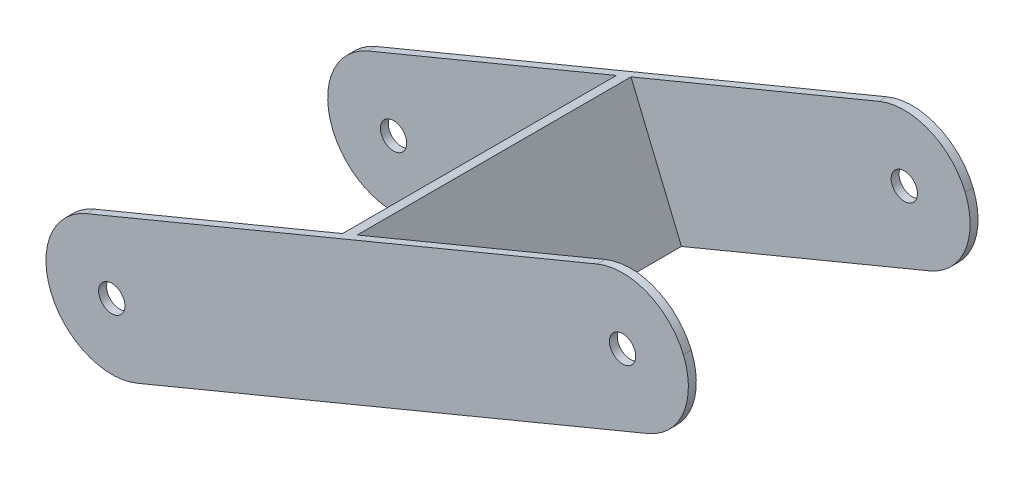
ISO-10303-21;
HEADER;
FILE_DESCRIPTION(('STEP AP214'),'2;1');
FILE_NAME('part.step','',(''),(''),'','','');
FILE_SCHEMA(('AUTOMOTIVE_DESIGN { 1 0 10303 214 1 1 1 1 }'));
ENDSEC;
DATA;
#1=APPLICATION_CONTEXT('core data for automotive mechanical design processes');
#2=APPLICATION_PROTOCOL_DEFINITION('international standard','automotive_design',2000,#1);
#3=PRODUCT_CONTEXT('',#1,'mechanical');
#4=PRODUCT('Part','Part','',(#3));
#5=PRODUCT_RELATED_PRODUCT_CATEGORY('part','',(#4));
#6=PRODUCT_DEFINITION_FORMATION('','',#4);
#7=PRODUCT_DEFINITION_CONTEXT('part definition',#1,'design');
#8=PRODUCT_DEFINITION('design','',#6,#7);
#9=PRODUCT_DEFINITION_SHAPE('','',#8);
#10=(LENGTH_UNIT() NAMED_UNIT(*) SI_UNIT(.MILLI.,.METRE.));
#11=(NAMED_UNIT(*) PLANE_ANGLE_UNIT() SI_UNIT($,.RADIAN.));
#12=(NAMED_UNIT(*) SI_UNIT($,.STERADIAN.) SOLID_ANGLE_UNIT());
#13=UNCERTAINTY_MEASURE_WITH_UNIT(LENGTH_MEASURE(1.E-05),#10,'distance_accuracy_value','');
#14=(GEOMETRIC_REPRESENTATION_CONTEXT(3) GLOBAL_UNCERTAINTY_ASSIGNED_CONTEXT((#13)) GLOBAL_UNIT_ASSIGNED_CONTEXT((#10,
#11,#12)) REPRESENTATION_CONTEXT('',''));
#15=CARTESIAN_POINT('',(0.,0.,0.));
#16=DIRECTION('',(0.,0.,1.));
#17=DIRECTION('',(1.,0.,0.));
#18=AXIS2_PLACEMENT_3D('',#15,#16,#17);
#19=CARTESIAN_POINT('',(167.042618659577,74.571027458116,-1.4821249531837));
#20=DIRECTION('',(0.,0.,1.));
#21=DIRECTION('',(0.923728021347068,0.383049008063238,0.));
#22=AXIS2_PLACEMENT_3D('',#19,#20,#21);
#23=PLANE('',#22);
#24=CARTESIAN_POINT('',(123.335010139646,42.9143542679577,-1.4821249531837));
#25=DIRECTION('',(0.,0.,-1.));
#26=DIRECTION('',(-0.923728021347068,-0.383049008063238,0.));
#27=AXIS2_PLACEMENT_3D('',#24,#25,#26);
#28=CIRCLE('',#27,2.5);
#29=CARTESIAN_POINT('',(121.025690086278,41.9567317477996,-1.4821249531837));
#30=VERTEX_POINT('',#29);
#31=EDGE_CURVE('E272',#30,#30,#28,.T.);
#32=ORIENTED_EDGE('',*,*,#31,.F.);
#33=EDGE_LOOP('',(#32));
#34=FACE_BOUND('',#33,.T.);
#35=CARTESIAN_POINT('',(220.326452381088,83.1345001145976,-1.4821249531837));
#36=DIRECTION('',(0.,0.,1.));
#37=DIRECTION('',(0.923728021347068,0.383049008063238,0.));
#38=AXIS2_PLACEMENT_3D('',#35,#36,#37);
#39=CIRCLE('',#38,2.5);
#40=CARTESIAN_POINT('',(222.635772434456,84.0921226347557,-1.4821249531837));
#41=VERTEX_POINT('',#40);
#42=EDGE_CURVE('E170',#41,#41,#39,.T.);
#43=ORIENTED_EDGE('',*,*,#42,.T.);
#44=EDGE_LOOP('',(#43));
#45=FACE_BOUND('',#44,.T.);
#46=DIRECTION('',(-0.923728021347068,-0.383049008063238,0.));
#47=VECTOR('',#46,1.);
#48=CARTESIAN_POINT('',(176.618843861158,51.4778269244393,-1.4821249531837));
#49=LINE('',#48,#47);
#50=CARTESIAN_POINT('',(225.114564981879,71.5878998477593,-1.4821249531837));
#51=VERTEX_POINT('',#50);
#52=CARTESIAN_POINT('',(128.123122740436,31.3677540011193,-1.4821249531837));
#53=VERTEX_POINT('',#52);
#54=EDGE_CURVE('E191',#51,#53,#49,.T.);
#55=ORIENTED_EDGE('',*,*,#54,.T.);
#56=CARTESIAN_POINT('',(123.335010139646,42.9143542679577,-1.4821249531837));
#57=DIRECTION('',(0.,0.,1.));
#58=DIRECTION('',(0.923728021347068,0.383049008063238,0.));
#59=AXIS2_PLACEMENT_3D('',#56,#57,#58);
#60=CIRCLE('',#59,12.5);
#61=CARTESIAN_POINT('',(111.788409872808,38.1262416671672,-1.4821249531837));
#62=VERTEX_POINT('',#61);
#63=EDGE_CURVE('E249',#53,#62,#60,.F.);
#64=ORIENTED_EDGE('',*,*,#63,.T.);
#65=CARTESIAN_POINT('',(123.335010139646,42.9143542679577,-1.4821249531837));
#66=DIRECTION('',(0.,0.,1.));
#67=DIRECTION('',(0.923728021347068,0.383049008063238,0.));
#68=AXIS2_PLACEMENT_3D('',#65,#66,#67);
#69=CIRCLE('',#68,12.5);
#70=CARTESIAN_POINT('',(118.546897538856,54.460954534796,-1.4821249531837));
#71=VERTEX_POINT('',#70);
#72=EDGE_CURVE('E247',#62,#71,#69,.F.);
#73=ORIENTED_EDGE('',*,*,#72,.T.);
#74=DIRECTION('',(-0.923728021347068,-0.383049008063238,0.));
#75=VECTOR('',#74,1.);
#76=CARTESIAN_POINT('',(167.042618659577,74.571027458116,-1.4821249531837));
#77=LINE('',#76,#75);
#78=CARTESIAN_POINT('',(215.538339780298,94.681100381436,-1.4821249531837));
#79=VERTEX_POINT('',#78);
#80=EDGE_CURVE('E178',#79,#71,#77,.T.);
#81=ORIENTED_EDGE('',*,*,#80,.F.);
#82=CARTESIAN_POINT('',(220.326452381088,83.1345001145976,-1.4821249531837));
#83=DIRECTION('',(0.,0.,1.));
#84=DIRECTION('',(0.923728021347068,0.383049008063238,0.));
#85=AXIS2_PLACEMENT_3D('',#82,#83,#84);
#86=CIRCLE('',#85,12.5);
#87=CARTESIAN_POINT('',(231.873052647927,87.9226127153881,-1.4821249531837));
#88=VERTEX_POINT('',#87);
#89=EDGE_CURVE('E208',#79,#88,#86,.F.);
#90=ORIENTED_EDGE('',*,*,#89,.T.);
#91=CARTESIAN_POINT('',(220.326452381088,83.1345001145976,-1.4821249531837));
#92=DIRECTION('',(0.,0.,1.));
#93=DIRECTION('',(0.923728021347068,0.383049008063238,0.));
#94=AXIS2_PLACEMENT_3D('',#91,#92,#93);
#95=CIRCLE('',#94,12.5);
#96=EDGE_CURVE('E210',#88,#51,#95,.F.);
#97=ORIENTED_EDGE('',*,*,#96,.T.);
#98=EDGE_LOOP('',(#55,#64,#73,#81,#90,#97));
#99=FACE_BOUND('',#98,.T.);
#100=ADVANCED_FACE('F16',(#34,#45,#99),#23,.F.);
#101=CARTESIAN_POINT('',(167.042618659577,74.571027458116,53.5178750468163));
#102=DIRECTION('',(0.,0.,-1.));
#103=DIRECTION('',(-0.923728021347068,-0.383049008063238,0.));
#104=AXIS2_PLACEMENT_3D('',#101,#102,#103);
#105=PLANE('',#104);
#106=CARTESIAN_POINT('',(123.335010139646,42.9143542679577,53.5178750468163));
#107=DIRECTION('',(0.,0.,-1.));
#108=DIRECTION('',(-0.923728021347068,-0.383049008063238,0.));
#109=AXIS2_PLACEMENT_3D('',#106,#107,#108);
#110=CIRCLE('',#109,2.5);
#111=CARTESIAN_POINT('',(121.025690086278,41.9567317477996,53.5178750468163));
#112=VERTEX_POINT('',#111);
#113=EDGE_CURVE('E276',#112,#112,#110,.T.);
#114=ORIENTED_EDGE('',*,*,#113,.T.);
#115=EDGE_LOOP('',(#114));
#116=FACE_BOUND('',#115,.T.);
#117=CARTESIAN_POINT('',(220.326452381088,83.1345001145976,53.5178750468163));
#118=DIRECTION('',(0.,0.,1.));
#119=DIRECTION('',(0.923728021347068,0.383049008063238,0.));
#120=AXIS2_PLACEMENT_3D('',#117,#118,#119);
#121=CIRCLE('',#120,2.5);
#122=CARTESIAN_POINT('',(222.635772434456,84.0921226347557,53.5178750468163));
#123=VERTEX_POINT('',#122);
#124=EDGE_CURVE('E141',#123,#123,#121,.T.);
#125=ORIENTED_EDGE('',*,*,#124,.F.);
#126=EDGE_LOOP('',(#125));
#127=FACE_BOUND('',#126,.T.);
#128=CARTESIAN_POINT('',(123.335010139646,42.9143542679577,53.5178750468163));
#129=DIRECTION('',(0.,0.,-1.));
#130=DIRECTION('',(-0.923728021347068,-0.383049008063238,0.));
#131=AXIS2_PLACEMENT_3D('',#128,#129,#130);
#132=CIRCLE('',#131,12.5);
#133=CARTESIAN_POINT('',(118.546897538856,54.460954534796,53.5178750468163));
#134=VERTEX_POINT('',#133);
#135=CARTESIAN_POINT('',(111.788409872808,38.1262416671672,53.5178750468163));
#136=VERTEX_POINT('',#135);
#137=EDGE_CURVE('E25',#134,#136,#132,.F.);
#138=ORIENTED_EDGE('',*,*,#137,.T.);
#139=CARTESIAN_POINT('',(123.335010139646,42.9143542679577,53.5178750468163));
#140=DIRECTION('',(0.,0.,-1.));
#141=DIRECTION('',(-0.923728021347068,-0.383049008063238,0.));
#142=AXIS2_PLACEMENT_3D('',#139,#140,#141);
#143=CIRCLE('',#142,12.5);
#144=CARTESIAN_POINT('',(128.123122740436,31.3677540011193,53.5178750468163));
#145=VERTEX_POINT('',#144);
#146=EDGE_CURVE('E10',#136,#145,#143,.F.);
#147=ORIENTED_EDGE('',*,*,#146,.T.);
#148=DIRECTION('',(0.923728021347068,0.383049008063238,0.));
#149=VECTOR('',#148,1.);
#150=CARTESIAN_POINT('',(176.618843861158,51.4778269244393,53.5178750468163));
#151=LINE('',#150,#149);
#152=CARTESIAN_POINT('',(225.114564981879,71.5878998477593,53.5178750468163));
#153=VERTEX_POINT('',#152);
#154=EDGE_CURVE('E194',#145,#153,#151,.T.);
#155=ORIENTED_EDGE('',*,*,#154,.T.);
#156=CARTESIAN_POINT('',(220.326452381088,83.1345001145976,53.5178750468163));
#157=DIRECTION('',(0.,0.,-1.));
#158=DIRECTION('',(-0.923728021347068,-0.383049008063238,0.));
#159=AXIS2_PLACEMENT_3D('',#156,#157,#158);
#160=CIRCLE('',#159,12.5);
#161=CARTESIAN_POINT('',(231.873052647927,87.9226127153881,53.5178750468163));
#162=VERTEX_POINT('',#161);
#163=EDGE_CURVE('E233',#153,#162,#160,.F.);
#164=ORIENTED_EDGE('',*,*,#163,.T.);
#165=CARTESIAN_POINT('',(220.326452381088,83.1345001145976,53.5178750468163));
#166=DIRECTION('',(0.,0.,-1.));
#167=DIRECTION('',(-0.923728021347068,-0.383049008063238,0.));
#168=AXIS2_PLACEMENT_3D('',#165,#166,#167);
#169=CIRCLE('',#168,12.5);
#170=CARTESIAN_POINT('',(215.538339780298,94.681100381436,53.5178750468163));
#171=VERTEX_POINT('',#170);
#172=EDGE_CURVE('E230',#162,#171,#169,.F.);
#173=ORIENTED_EDGE('',*,*,#172,.T.);
#174=DIRECTION('',(0.923728021347068,0.383049008063238,0.));
#175=VECTOR('',#174,1.);
#176=CARTESIAN_POINT('',(167.042618659577,74.571027458116,53.5178750468163));
#177=LINE('',#176,#175);
#178=EDGE_CURVE('E180',#134,#171,#177,.T.);
#179=ORIENTED_EDGE('',*,*,#178,.F.);
#180=EDGE_LOOP('',(#138,#147,#155,#164,#173,#179));
#181=FACE_BOUND('',#180,.T.);
#182=ADVANCED_FACE('F280',(#116,#127,#181),#105,.F.);
#183=CARTESIAN_POINT('',(168.428210691597,75.1456009702109,52.0178750468163));
#184=DIRECTION('',(0.,0.,1.));
#185=DIRECTION('',(0.923728021347068,0.383049008063238,0.));
#186=AXIS2_PLACEMENT_3D('',#183,#184,#185);
#187=PLANE('',#186);
#188=CARTESIAN_POINT('',(220.326452381088,83.1345001145976,52.0178750468163));
#189=DIRECTION('',(0.,0.,1.));
#190=DIRECTION('',(0.923728021347068,0.383049008063238,0.));
#191=AXIS2_PLACEMENT_3D('',#188,#189,#190);
#192=CIRCLE('',#191,2.5);
#193=CARTESIAN_POINT('',(222.635772434456,84.0921226347557,52.0178750468163));
#194=VERTEX_POINT('',#193);
#195=EDGE_CURVE('E174',#194,#194,#192,.T.);
#196=ORIENTED_EDGE('',*,*,#195,.T.);
#197=EDGE_LOOP('',(#196));
#198=FACE_BOUND('',#197,.T.);
#199=CARTESIAN_POINT('',(220.326452381088,83.1345001145976,52.0178750468163));
#200=DIRECTION('',(0.,0.,1.));
#201=DIRECTION('',(0.923728021347068,0.383049008063238,0.));
#202=AXIS2_PLACEMENT_3D('',#199,#200,#201);
#203=CIRCLE('',#202,12.5);
#204=CARTESIAN_POINT('',(215.538339780298,94.681100381436,52.0178750468163));
#205=VERTEX_POINT('',#204);
#206=CARTESIAN_POINT('',(231.873052647927,87.9226127153881,52.0178750468163));
#207=VERTEX_POINT('',#206);
#208=EDGE_CURVE('E226',#205,#207,#203,.F.);
#209=ORIENTED_EDGE('',*,*,#208,.T.);
#210=CARTESIAN_POINT('',(220.326452381088,83.1345001145976,52.0178750468163));
#211=DIRECTION('',(0.,0.,1.));
#212=DIRECTION('',(0.923728021347068,0.383049008063238,0.));
#213=AXIS2_PLACEMENT_3D('',#210,#211,#212);
#214=CIRCLE('',#213,12.5);
#215=CARTESIAN_POINT('',(225.114564981879,71.5878998477593,52.0178750468163));
#216=VERTEX_POINT('',#215);
#217=EDGE_CURVE('E228',#207,#216,#214,.F.);
#218=ORIENTED_EDGE('',*,*,#217,.T.);
#219=DIRECTION('',(-0.923728021347068,-0.383049008063238,0.));
#220=VECTOR('',#219,1.);
#221=CARTESIAN_POINT('',(178.004435893178,52.0524004365342,52.0178750468163));
#222=LINE('',#221,#220);
#223=CARTESIAN_POINT('',(178.004435893178,52.0524004365342,52.0178750468163));
#224=VERTEX_POINT('',#223);
#225=EDGE_CURVE('E197',#216,#224,#222,.T.);
#226=ORIENTED_EDGE('',*,*,#225,.T.);
#227=DIRECTION('',(0.383049008063238,-0.923728021347068,0.));
#228=VECTOR('',#227,1.);
#229=CARTESIAN_POINT('',(168.428210691597,75.1456009702109,52.0178750468163));
#230=LINE('',#229,#228);
#231=CARTESIAN_POINT('',(168.428210691597,75.1456009702109,52.0178750468163));
#232=VERTEX_POINT('',#231);
#233=EDGE_CURVE('E205',#232,#224,#230,.T.);
#234=ORIENTED_EDGE('',*,*,#233,.F.);
#235=DIRECTION('',(-0.923728021347068,-0.383049008063238,0.));
#236=VECTOR('',#235,1.);
#237=CARTESIAN_POINT('',(168.428210691597,75.1456009702109,52.0178750468163));
#238=LINE('',#237,#236);
#239=EDGE_CURVE('E183',#205,#232,#238,.T.);
#240=ORIENTED_EDGE('',*,*,#239,.F.);
#241=EDGE_LOOP('',(#209,#218,#226,#234,#240));
#242=FACE_BOUND('',#241,.T.);
#243=ADVANCED_FACE('F303',(#198,#242),#187,.F.);
#244=CARTESIAN_POINT('',(168.428210691597,75.1456009702109,52.0178750468163));
#245=DIRECTION('',(-0.923728021347068,-0.383049008063238,0.));
#246=DIRECTION('',(0.,0.,1.));
#247=AXIS2_PLACEMENT_3D('',#244,#245,#246);
#248=PLANE('',#247);
#249=DIRECTION('',(0.,0.,-1.));
#250=VECTOR('',#249,1.);
#251=CARTESIAN_POINT('',(178.004435893178,52.0524004365342,52.0178750468163));
#252=LINE('',#251,#250);
#253=CARTESIAN_POINT('',(178.004435893178,52.0524004365342,0.0178750468163014));
#254=VERTEX_POINT('',#253);
#255=EDGE_CURVE('E199',#224,#254,#252,.T.);
#256=ORIENTED_EDGE('',*,*,#255,.T.);
#257=DIRECTION('',(0.383049008063238,-0.923728021347068,0.));
#258=VECTOR('',#257,1.);
#259=CARTESIAN_POINT('',(168.428210691597,75.1456009702109,0.0178750468163014));
#260=LINE('',#259,#258);
#261=CARTESIAN_POINT('',(168.428210691597,75.1456009702109,0.0178750468163014));
#262=VERTEX_POINT('',#261);
#263=EDGE_CURVE('E190',#262,#254,#260,.T.);
#264=ORIENTED_EDGE('',*,*,#263,.F.);
#265=DIRECTION('',(0.,0.,-1.));
#266=VECTOR('',#265,1.);
#267=CARTESIAN_POINT('',(168.428210691597,75.1456009702109,52.0178750468163));
#268=LINE('',#267,#266);
#269=EDGE_CURVE('E185',#232,#262,#268,.T.);
#270=ORIENTED_EDGE('',*,*,#269,.F.);
#271=ORIENTED_EDGE('',*,*,#233,.T.);
#272=EDGE_LOOP('',(#256,#264,#270,#271));
#273=FACE_BOUND('',#272,.T.);
#274=ADVANCED_FACE('F364',(#273),#248,.F.);
#275=CARTESIAN_POINT('',(168.428210691597,75.1456009702109,0.0178750468163014));
#276=DIRECTION('',(0.,0.,-1.));
#277=DIRECTION('',(-0.923728021347068,-0.383049008063238,0.));
#278=AXIS2_PLACEMENT_3D('',#275,#276,#277);
#279=PLANE('',#278);
#280=CARTESIAN_POINT('',(220.326452381088,83.1345001145976,0.0178750468163014));
#281=DIRECTION('',(0.,0.,-1.));
#282=DIRECTION('',(-0.923728021347068,-0.383049008063238,0.));
#283=AXIS2_PLACEMENT_3D('',#280,#281,#282);
#284=CIRCLE('',#283,2.5);
#285=CARTESIAN_POINT('',(218.017132327721,82.1768775944395,0.0178750468163014));
#286=VERTEX_POINT('',#285);
#287=EDGE_CURVE('E173',#286,#286,#284,.T.);
#288=ORIENTED_EDGE('',*,*,#287,.T.);
#289=EDGE_LOOP('',(#288));
#290=FACE_BOUND('',#289,.T.);
#291=DIRECTION('',(0.923728021347068,0.383049008063238,0.));
#292=VECTOR('',#291,1.);
#293=CARTESIAN_POINT('',(178.004435893178,52.0524004365342,0.0178750468163014));
#294=LINE('',#293,#292);
#295=CARTESIAN_POINT('',(225.114564981879,71.5878998477593,0.0178750468163014));
#296=VERTEX_POINT('',#295);
#297=EDGE_CURVE('E181',#254,#296,#294,.T.);
#298=ORIENTED_EDGE('',*,*,#297,.T.);
#299=CARTESIAN_POINT('',(220.326452381088,83.1345001145976,0.0178750468163014));
#300=DIRECTION('',(0.,0.,-1.));
#301=DIRECTION('',(-0.923728021347068,-0.383049008063238,0.));
#302=AXIS2_PLACEMENT_3D('',#299,#300,#301);
#303=CIRCLE('',#302,12.5);
#304=CARTESIAN_POINT('',(231.873052647927,87.9226127153881,0.0178750468163014));
#305=VERTEX_POINT('',#304);
#306=EDGE_CURVE('E220',#296,#305,#303,.F.);
#307=ORIENTED_EDGE('',*,*,#306,.T.);
#308=CARTESIAN_POINT('',(220.326452381088,83.1345001145976,0.0178750468163014));
#309=DIRECTION('',(0.,0.,-1.));
#310=DIRECTION('',(-0.923728021347068,-0.383049008063238,0.));
#311=AXIS2_PLACEMENT_3D('',#308,#309,#310);
#312=CIRCLE('',#311,12.5);
#313=CARTESIAN_POINT('',(215.538339780298,94.681100381436,0.0178750468163014));
#314=VERTEX_POINT('',#313);
#315=EDGE_CURVE('E218',#305,#314,#312,.F.);
#316=ORIENTED_EDGE('',*,*,#315,.T.);
#317=DIRECTION('',(0.923728021347068,0.383049008063238,0.));
#318=VECTOR('',#317,1.);
#319=CARTESIAN_POINT('',(168.428210691597,75.1456009702109,0.0178750468163014));
#320=LINE('',#319,#318);
#321=EDGE_CURVE('E187',#262,#314,#320,.T.);
#322=ORIENTED_EDGE('',*,*,#321,.F.);
#323=ORIENTED_EDGE('',*,*,#263,.T.);
#324=EDGE_LOOP('',(#298,#307,#316,#322,#323));
#325=FACE_BOUND('',#324,.T.);
#326=ADVANCED_FACE('F376',(#290,#325),#279,.F.);
#327=CARTESIAN_POINT('',(197.063779353356,87.0201202201713,26.0178750468163));
#328=DIRECTION('',(-0.383049008063238,0.923728021347068,0.));
#329=DIRECTION('',(-0.923728021347068,-0.383049008063238,0.));
#330=AXIS2_PLACEMENT_3D('',#327,#328,#329);
#331=PLANE('',#330);
#332=ORIENTED_EDGE('',*,*,#80,.T.);
#333=DIRECTION('',(0.,0.,-1.));
#334=VECTOR('',#333,1.);
#335=CARTESIAN_POINT('',(118.546897538856,54.460954534796,26.0178750468163));
#336=LINE('',#335,#334);
#337=CARTESIAN_POINT('',(118.546897538856,54.460954534796,0.0178750468163014));
#338=VERTEX_POINT('',#337);
#339=EDGE_CURVE('E151',#71,#338,#336,.F.);
#340=ORIENTED_EDGE('',*,*,#339,.T.);
#341=DIRECTION('',(-0.923728021347068,-0.383049008063238,0.));
#342=VECTOR('',#341,1.);
#343=CARTESIAN_POINT('',(165.657026627556,73.9964539460211,0.0178750468163014));
#344=LINE('',#343,#342);
#345=CARTESIAN_POINT('',(165.657026627556,73.9964539460211,0.0178750468163014));
#346=VERTEX_POINT('',#345);
#347=EDGE_CURVE('E133',#346,#338,#344,.T.);
#348=ORIENTED_EDGE('',*,*,#347,.F.);
#349=DIRECTION('',(0.,0.,-1.));
#350=VECTOR('',#349,1.);
#351=CARTESIAN_POINT('',(165.657026627556,73.9964539460211,52.0178750468163));
#352=LINE('',#351,#350);
#353=CARTESIAN_POINT('',(165.657026627556,73.9964539460211,52.0178750468163));
#354=VERTEX_POINT('',#353);
#355=EDGE_CURVE('E149',#354,#346,#352,.T.);
#356=ORIENTED_EDGE('',*,*,#355,.F.);
#357=DIRECTION('',(0.923728021347068,0.383049008063238,0.));
#358=VECTOR('',#357,1.);
#359=CARTESIAN_POINT('',(165.657026627556,73.9964539460211,52.0178750468163));
#360=LINE('',#359,#358);
#361=CARTESIAN_POINT('',(118.546897538856,54.460954534796,52.0178750468163));
#362=VERTEX_POINT('',#361);
#363=EDGE_CURVE('E157',#362,#354,#360,.T.);
#364=ORIENTED_EDGE('',*,*,#363,.F.);
#365=DIRECTION('',(0.,0.,-1.));
#366=VECTOR('',#365,1.);
#367=CARTESIAN_POINT('',(118.546897538856,54.460954534796,26.0178750468163));
#368=LINE('',#367,#366);
#369=EDGE_CURVE('E255',#362,#134,#368,.F.);
#370=ORIENTED_EDGE('',*,*,#369,.T.);
#371=ORIENTED_EDGE('',*,*,#178,.T.);
#372=DIRECTION('',(0.,0.,-1.));
#373=VECTOR('',#372,1.);
#374=CARTESIAN_POINT('',(215.538339780298,94.681100381436,52.0178750468163));
#375=LINE('',#374,#373);
#376=EDGE_CURVE('E222',#171,#205,#375,.T.);
#377=ORIENTED_EDGE('',*,*,#376,.T.);
#378=ORIENTED_EDGE('',*,*,#239,.T.);
#379=ORIENTED_EDGE('',*,*,#269,.T.);
#380=ORIENTED_EDGE('',*,*,#321,.T.);
#381=DIRECTION('',(0.,0.,-1.));
#382=VECTOR('',#381,1.);
#383=CARTESIAN_POINT('',(215.538339780298,94.681100381436,-1.4821249531837));
#384=LINE('',#383,#382);
#385=EDGE_CURVE('E224',#314,#79,#384,.T.);
#386=ORIENTED_EDGE('',*,*,#385,.T.);
#387=EDGE_LOOP('',(#332,#340,#348,#356,#364,#370,#371,#377,#378,#379,#380,#386));
#388=FACE_BOUND('',#387,.T.);
#389=ADVANCED_FACE('F147',(#388),#331,.T.);
#390=CARTESIAN_POINT('',(206.640004554937,63.9269196864945,26.0178750468163));
#391=DIRECTION('',(-0.383049008063238,0.923728021347068,0.));
#392=DIRECTION('',(-0.923728021347068,-0.383049008063238,0.));
#393=AXIS2_PLACEMENT_3D('',#390,#391,#392);
#394=PLANE('',#393);
#395=DIRECTION('',(-0.923728021347068,-0.383049008063238,0.));
#396=VECTOR('',#395,1.);
#397=CARTESIAN_POINT('',(175.233251829137,50.9032534123444,0.0178750468163014));
#398=LINE('',#397,#396);
#399=CARTESIAN_POINT('',(175.233251829137,50.9032534123444,0.0178750468163014));
#400=VERTEX_POINT('',#399);
#401=CARTESIAN_POINT('',(128.123122740436,31.3677540011193,0.0178750468163014));
#402=VERTEX_POINT('',#401);
#403=EDGE_CURVE('E136',#400,#402,#398,.T.);
#404=ORIENTED_EDGE('',*,*,#403,.T.);
#405=DIRECTION('',(0.,0.,-1.));
#406=VECTOR('',#405,1.);
#407=CARTESIAN_POINT('',(128.123122740436,31.3677540011193,-1.4821249531837));
#408=LINE('',#407,#406);
#409=EDGE_CURVE('E244',#402,#53,#408,.T.);
#410=ORIENTED_EDGE('',*,*,#409,.T.);
#411=ORIENTED_EDGE('',*,*,#54,.F.);
#412=DIRECTION('',(0.,0.,-1.));
#413=VECTOR('',#412,1.);
#414=CARTESIAN_POINT('',(225.114564981879,71.5878998477593,26.0178750468163));
#415=LINE('',#414,#413);
#416=EDGE_CURVE('E215',#51,#296,#415,.F.);
#417=ORIENTED_EDGE('',*,*,#416,.T.);
#418=ORIENTED_EDGE('',*,*,#297,.F.);
#419=ORIENTED_EDGE('',*,*,#255,.F.);
#420=ORIENTED_EDGE('',*,*,#225,.F.);
#421=DIRECTION('',(0.,0.,-1.));
#422=VECTOR('',#421,1.);
#423=CARTESIAN_POINT('',(225.114564981879,71.5878998477593,26.0178750468163));
#424=LINE('',#423,#422);
#425=EDGE_CURVE('E212',#216,#153,#424,.F.);
#426=ORIENTED_EDGE('',*,*,#425,.T.);
#427=ORIENTED_EDGE('',*,*,#154,.F.);
#428=DIRECTION('',(0.,0.,-1.));
#429=VECTOR('',#428,1.);
#430=CARTESIAN_POINT('',(128.123122740436,31.3677540011193,52.0178750468163));
#431=LINE('',#430,#429);
#432=CARTESIAN_POINT('',(128.123122740436,31.3677540011193,52.0178750468163));
#433=VERTEX_POINT('',#432);
#434=EDGE_CURVE('E235',#145,#433,#431,.T.);
#435=ORIENTED_EDGE('',*,*,#434,.T.);
#436=DIRECTION('',(0.923728021347068,0.383049008063238,0.));
#437=VECTOR('',#436,1.);
#438=CARTESIAN_POINT('',(175.233251829137,50.9032534123444,52.0178750468163));
#439=LINE('',#438,#437);
#440=CARTESIAN_POINT('',(175.233251829137,50.9032534123444,52.0178750468163));
#441=VERTEX_POINT('',#440);
#442=EDGE_CURVE('E152',#433,#441,#439,.T.);
#443=ORIENTED_EDGE('',*,*,#442,.T.);
#444=DIRECTION('',(0.,0.,-1.));
#445=VECTOR('',#444,1.);
#446=CARTESIAN_POINT('',(175.233251829137,50.9032534123444,52.0178750468163));
#447=LINE('',#446,#445);
#448=EDGE_CURVE('E163',#441,#400,#447,.T.);
#449=ORIENTED_EDGE('',*,*,#448,.T.);
#450=EDGE_LOOP('',(#404,#410,#411,#417,#418,#419,#420,#426,#427,#435,#443,#449));
#451=FACE_BOUND('',#450,.T.);
#452=ADVANCED_FACE('F317',(#451),#394,.F.);
#453=CARTESIAN_POINT('',(220.326452381088,83.1345001145976,26.0178750468163));
#454=DIRECTION('',(0.,0.,1.));
#455=DIRECTION('',(0.923728021347068,0.383049008063238,0.));
#456=AXIS2_PLACEMENT_3D('',#453,#454,#455);
#457=CYLINDRICAL_SURFACE('',#456,12.5);
#458=ORIENTED_EDGE('',*,*,#385,.F.);
#459=ORIENTED_EDGE('',*,*,#315,.F.);
#460=DIRECTION('',(0.,0.,-1.));
#461=VECTOR('',#460,1.);
#462=CARTESIAN_POINT('',(231.873052647927,87.9226127153881,0.0178750468163014));
#463=LINE('',#462,#461);
#464=EDGE_CURVE('E195',#88,#305,#463,.F.);
#465=ORIENTED_EDGE('',*,*,#464,.F.);
#466=ORIENTED_EDGE('',*,*,#89,.F.);
#467=EDGE_LOOP('',(#458,#459,#465,#466));
#468=FACE_BOUND('',#467,.T.);
#469=ADVANCED_FACE('F313',(#468),#457,.T.);
#470=CARTESIAN_POINT('',(220.326452381088,83.1345001145976,-1.4821249531837));
#471=DIRECTION('',(0.,0.,-1.));
#472=DIRECTION('',(-0.923728021347068,-0.383049008063238,0.));
#473=AXIS2_PLACEMENT_3D('',#470,#471,#472);
#474=CYLINDRICAL_SURFACE('',#473,12.5);
#475=ORIENTED_EDGE('',*,*,#306,.F.);
#476=ORIENTED_EDGE('',*,*,#416,.F.);
#477=ORIENTED_EDGE('',*,*,#96,.F.);
#478=ORIENTED_EDGE('',*,*,#464,.T.);
#479=EDGE_LOOP('',(#475,#476,#477,#478));
#480=FACE_BOUND('',#479,.T.);
#481=ADVANCED_FACE('F309',(#480),#474,.T.);
#482=CARTESIAN_POINT('',(220.326452381088,83.1345001145976,26.0178750468163));
#483=DIRECTION('',(0.,0.,1.));
#484=DIRECTION('',(0.923728021347068,0.383049008063238,0.));
#485=AXIS2_PLACEMENT_3D('',#482,#483,#484);
#486=CYLINDRICAL_SURFACE('',#485,12.5);
#487=ORIENTED_EDGE('',*,*,#376,.F.);
#488=ORIENTED_EDGE('',*,*,#172,.F.);
#489=DIRECTION('',(0.,0.,-1.));
#490=VECTOR('',#489,1.);
#491=CARTESIAN_POINT('',(231.873052647927,87.9226127153881,53.5178750468163));
#492=LINE('',#491,#490);
#493=EDGE_CURVE('E177',#207,#162,#492,.F.);
#494=ORIENTED_EDGE('',*,*,#493,.F.);
#495=ORIENTED_EDGE('',*,*,#208,.F.);
#496=EDGE_LOOP('',(#487,#488,#494,#495));
#497=FACE_BOUND('',#496,.T.);
#498=ADVANCED_FACE('F312',(#497),#486,.T.);
#499=CARTESIAN_POINT('',(220.326452381088,83.1345001145976,52.0178750468163));
#500=DIRECTION('',(0.,0.,-1.));
#501=DIRECTION('',(-0.923728021347068,-0.383049008063238,0.));
#502=AXIS2_PLACEMENT_3D('',#499,#500,#501);
#503=CYLINDRICAL_SURFACE('',#502,12.5);
#504=ORIENTED_EDGE('',*,*,#163,.F.);
#505=ORIENTED_EDGE('',*,*,#425,.F.);
#506=ORIENTED_EDGE('',*,*,#217,.F.);
#507=ORIENTED_EDGE('',*,*,#493,.T.);
#508=EDGE_LOOP('',(#504,#505,#506,#507));
#509=FACE_BOUND('',#508,.T.);
#510=ADVANCED_FACE('F319',(#509),#503,.T.);
#511=CARTESIAN_POINT('',(220.326452381088,83.1345001145976,-1.4821249531837));
#512=DIRECTION('',(0.,0.,1.));
#513=DIRECTION('',(0.923728021347068,0.383049008063238,0.));
#514=AXIS2_PLACEMENT_3D('',#511,#512,#513);
#515=CYLINDRICAL_SURFACE('',#514,2.5);
#516=ORIENTED_EDGE('',*,*,#42,.F.);
#517=EDGE_LOOP('',(#516));
#518=FACE_BOUND('',#517,.T.);
#519=ORIENTED_EDGE('',*,*,#287,.F.);
#520=EDGE_LOOP('',(#519));
#521=FACE_BOUND('',#520,.T.);
#522=ADVANCED_FACE('F322',(#518,#521),#515,.F.);
#523=ORIENTED_EDGE('',*,*,#124,.T.);
#524=EDGE_LOOP('',(#523));
#525=FACE_BOUND('',#524,.T.);
#526=ORIENTED_EDGE('',*,*,#195,.F.);
#527=EDGE_LOOP('',(#526));
#528=FACE_BOUND('',#527,.T.);
#529=ADVANCED_FACE('F393',(#525,#528),#515,.F.);
#530=CARTESIAN_POINT('',(165.657026627556,73.9964539460211,0.0178750468163014));
#531=DIRECTION('',(0.,0.,1.));
#532=DIRECTION('',(0.923728021347068,0.383049008063238,0.));
#533=AXIS2_PLACEMENT_3D('',#530,#531,#532);
#534=PLANE('',#533);
#535=CARTESIAN_POINT('',(123.335010139646,42.9143542679577,0.0178750468163014));
#536=DIRECTION('',(0.,0.,1.));
#537=DIRECTION('',(0.923728021347068,0.383049008063238,0.));
#538=AXIS2_PLACEMENT_3D('',#535,#536,#537);
#539=CIRCLE('',#538,2.5);
#540=CARTESIAN_POINT('',(125.644330193014,43.8719767881158,0.0178750468163014));
#541=VERTEX_POINT('',#540);
#542=EDGE_CURVE('E265',#541,#541,#539,.F.);
#543=ORIENTED_EDGE('',*,*,#542,.T.);
#544=EDGE_LOOP('',(#543));
#545=FACE_BOUND('',#544,.T.);
#546=CARTESIAN_POINT('',(123.335010139646,42.9143542679577,0.0178750468163014));
#547=DIRECTION('',(0.,0.,1.));
#548=DIRECTION('',(0.923728021347068,0.383049008063238,0.));
#549=AXIS2_PLACEMENT_3D('',#546,#547,#548);
#550=CIRCLE('',#549,12.5);
#551=CARTESIAN_POINT('',(111.788409872808,38.1262416671672,0.0178750468163014));
#552=VERTEX_POINT('',#551);
#553=EDGE_CURVE('E251',#338,#552,#550,.T.);
#554=ORIENTED_EDGE('',*,*,#553,.T.);
#555=CARTESIAN_POINT('',(123.335010139646,42.9143542679577,0.0178750468163014));
#556=DIRECTION('',(0.,0.,1.));
#557=DIRECTION('',(0.923728021347068,0.383049008063238,0.));
#558=AXIS2_PLACEMENT_3D('',#555,#556,#557);
#559=CIRCLE('',#558,12.5);
#560=EDGE_CURVE('E253',#552,#402,#559,.T.);
#561=ORIENTED_EDGE('',*,*,#560,.T.);
#562=ORIENTED_EDGE('',*,*,#403,.F.);
#563=DIRECTION('',(0.383049008063238,-0.923728021347068,0.));
#564=VECTOR('',#563,1.);
#565=CARTESIAN_POINT('',(165.657026627556,73.9964539460211,0.0178750468163014));
#566=LINE('',#565,#564);
#567=EDGE_CURVE('E130',#346,#400,#566,.T.);
#568=ORIENTED_EDGE('',*,*,#567,.F.);
#569=ORIENTED_EDGE('',*,*,#347,.T.);
#570=EDGE_LOOP('',(#554,#561,#562,#568,#569));
#571=FACE_BOUND('',#570,.T.);
#572=ADVANCED_FACE('F132',(#545,#571),#534,.T.);
#573=CARTESIAN_POINT('',(165.657026627556,73.9964539460211,52.0178750468163));
#574=DIRECTION('',(-0.923728021347068,-0.383049008063238,0.));
#575=DIRECTION('',(0.,0.,1.));
#576=AXIS2_PLACEMENT_3D('',#573,#574,#575);
#577=PLANE('',#576);
#578=ORIENTED_EDGE('',*,*,#448,.F.);
#579=DIRECTION('',(0.383049008063238,-0.923728021347068,0.));
#580=VECTOR('',#579,1.);
#581=CARTESIAN_POINT('',(165.657026627556,73.9964539460211,52.0178750468163));
#582=LINE('',#581,#580);
#583=EDGE_CURVE('E142',#354,#441,#582,.T.);
#584=ORIENTED_EDGE('',*,*,#583,.F.);
#585=ORIENTED_EDGE('',*,*,#355,.T.);
#586=ORIENTED_EDGE('',*,*,#567,.T.);
#587=EDGE_LOOP('',(#578,#584,#585,#586));
#588=FACE_BOUND('',#587,.T.);
#589=ADVANCED_FACE('F155',(#588),#577,.T.);
#590=CARTESIAN_POINT('',(165.657026627556,73.9964539460211,52.0178750468163));
#591=DIRECTION('',(0.,0.,-1.));
#592=DIRECTION('',(-0.923728021347068,-0.383049008063238,0.));
#593=AXIS2_PLACEMENT_3D('',#590,#591,#592);
#594=PLANE('',#593);
#595=CARTESIAN_POINT('',(123.335010139646,42.9143542679577,52.0178750468163));
#596=DIRECTION('',(0.,0.,-1.));
#597=DIRECTION('',(-0.923728021347068,-0.383049008063238,0.));
#598=AXIS2_PLACEMENT_3D('',#595,#596,#597);
#599=CIRCLE('',#598,2.5);
#600=CARTESIAN_POINT('',(121.025690086278,41.9567317477996,52.0178750468163));
#601=VERTEX_POINT('',#600);
#602=EDGE_CURVE('E20',#601,#601,#599,.F.);
#603=ORIENTED_EDGE('',*,*,#602,.T.);
#604=EDGE_LOOP('',(#603));
#605=FACE_BOUND('',#604,.T.);
#606=ORIENTED_EDGE('',*,*,#442,.F.);
#607=CARTESIAN_POINT('',(123.335010139646,42.9143542679577,52.0178750468163));
#608=DIRECTION('',(0.,0.,-1.));
#609=DIRECTION('',(-0.923728021347068,-0.383049008063238,0.));
#610=AXIS2_PLACEMENT_3D('',#607,#608,#609);
#611=CIRCLE('',#610,12.5);
#612=CARTESIAN_POINT('',(111.788409872808,38.1262416671672,52.0178750468163));
#613=VERTEX_POINT('',#612);
#614=EDGE_CURVE('E39',#433,#613,#611,.T.);
#615=ORIENTED_EDGE('',*,*,#614,.T.);
#616=CARTESIAN_POINT('',(123.335010139646,42.9143542679577,52.0178750468163));
#617=DIRECTION('',(0.,0.,-1.));
#618=DIRECTION('',(-0.923728021347068,-0.383049008063238,0.));
#619=AXIS2_PLACEMENT_3D('',#616,#617,#618);
#620=CIRCLE('',#619,12.5);
#621=EDGE_CURVE('E258',#613,#362,#620,.T.);
#622=ORIENTED_EDGE('',*,*,#621,.T.);
#623=ORIENTED_EDGE('',*,*,#363,.T.);
#624=ORIENTED_EDGE('',*,*,#583,.T.);
#625=EDGE_LOOP('',(#606,#615,#622,#623,#624));
#626=FACE_BOUND('',#625,.T.);
#627=ADVANCED_FACE('F333',(#605,#626),#594,.T.);
#628=CARTESIAN_POINT('',(123.335010139646,42.9143542679577,-1.4821249531837));
#629=DIRECTION('',(0.,0.,-1.));
#630=DIRECTION('',(-0.923728021347068,-0.383049008063238,0.));
#631=AXIS2_PLACEMENT_3D('',#628,#629,#630);
#632=CYLINDRICAL_SURFACE('',#631,12.5);
#633=DIRECTION('',(0.,0.,-1.));
#634=VECTOR('',#633,1.);
#635=CARTESIAN_POINT('',(111.788409872808,38.1262416671672,-1.4821249531837));
#636=LINE('',#635,#634);
#637=EDGE_CURVE('E164',#552,#62,#636,.T.);
#638=ORIENTED_EDGE('',*,*,#637,.F.);
#639=ORIENTED_EDGE('',*,*,#553,.F.);
#640=ORIENTED_EDGE('',*,*,#339,.F.);
#641=ORIENTED_EDGE('',*,*,#72,.F.);
#642=EDGE_LOOP('',(#638,#639,#640,#641));
#643=FACE_BOUND('',#642,.T.);
#644=ADVANCED_FACE('F330',(#643),#632,.T.);
#645=CARTESIAN_POINT('',(123.335010139646,42.9143542679577,26.0178750468163));
#646=DIRECTION('',(0.,0.,1.));
#647=DIRECTION('',(0.923728021347068,0.383049008063238,0.));
#648=AXIS2_PLACEMENT_3D('',#645,#646,#647);
#649=CYLINDRICAL_SURFACE('',#648,12.5);
#650=ORIENTED_EDGE('',*,*,#560,.F.);
#651=ORIENTED_EDGE('',*,*,#637,.T.);
#652=ORIENTED_EDGE('',*,*,#63,.F.);
#653=ORIENTED_EDGE('',*,*,#409,.F.);
#654=EDGE_LOOP('',(#650,#651,#652,#653));
#655=FACE_BOUND('',#654,.T.);
#656=ADVANCED_FACE('F327',(#655),#649,.T.);
#657=CARTESIAN_POINT('',(123.335010139646,42.9143542679577,52.0178750468163));
#658=DIRECTION('',(0.,0.,-1.));
#659=DIRECTION('',(-0.923728021347068,-0.383049008063238,0.));
#660=AXIS2_PLACEMENT_3D('',#657,#658,#659);
#661=CYLINDRICAL_SURFACE('',#660,12.5);
#662=DIRECTION('',(0.,0.,-1.));
#663=VECTOR('',#662,1.);
#664=CARTESIAN_POINT('',(111.788409872808,38.1262416671672,52.0178750468163));
#665=LINE('',#664,#663);
#666=EDGE_CURVE('E263',#136,#613,#665,.T.);
#667=ORIENTED_EDGE('',*,*,#666,.F.);
#668=ORIENTED_EDGE('',*,*,#137,.F.);
#669=ORIENTED_EDGE('',*,*,#369,.F.);
#670=ORIENTED_EDGE('',*,*,#621,.F.);
#671=EDGE_LOOP('',(#667,#668,#669,#670));
#672=FACE_BOUND('',#671,.T.);
#673=ADVANCED_FACE('F18',(#672),#661,.T.);
#674=CARTESIAN_POINT('',(123.335010139646,42.9143542679577,26.0178750468163));
#675=DIRECTION('',(0.,0.,1.));
#676=DIRECTION('',(0.923728021347068,0.383049008063238,0.));
#677=AXIS2_PLACEMENT_3D('',#674,#675,#676);
#678=CYLINDRICAL_SURFACE('',#677,12.5);
#679=ORIENTED_EDGE('',*,*,#146,.F.);
#680=ORIENTED_EDGE('',*,*,#666,.T.);
#681=ORIENTED_EDGE('',*,*,#614,.F.);
#682=ORIENTED_EDGE('',*,*,#434,.F.);
#683=EDGE_LOOP('',(#679,#680,#681,#682));
#684=FACE_BOUND('',#683,.T.);
#685=ADVANCED_FACE('F286',(#684),#678,.T.);
#686=CARTESIAN_POINT('',(123.335010139646,42.9143542679577,-1.4821249531837));
#687=DIRECTION('',(0.,0.,1.));
#688=DIRECTION('',(0.923728021347068,0.383049008063238,0.));
#689=AXIS2_PLACEMENT_3D('',#686,#687,#688);
#690=CYLINDRICAL_SURFACE('',#689,2.5);
#691=ORIENTED_EDGE('',*,*,#602,.F.);
#692=EDGE_LOOP('',(#691));
#693=FACE_BOUND('',#692,.T.);
#694=ORIENTED_EDGE('',*,*,#113,.F.);
#695=EDGE_LOOP('',(#694));
#696=FACE_BOUND('',#695,.T.);
#697=ADVANCED_FACE('F283',(#693,#696),#690,.F.);
#698=ORIENTED_EDGE('',*,*,#542,.F.);
#699=EDGE_LOOP('',(#698));
#700=FACE_BOUND('',#699,.T.);
#701=ORIENTED_EDGE('',*,*,#31,.T.);
#702=EDGE_LOOP('',(#701));
#703=FACE_BOUND('',#702,.T.);
#704=ADVANCED_FACE('F285',(#700,#703),#690,.F.);
#705=CLOSED_SHELL('',(#100,#182,#243,#274,#326,#389,#452,#469,#481,#498,#510,#522,#529,#572,
#589,#627,#644,#656,#673,#685,#697,#704));
#706=MANIFOLD_SOLID_BREP('B1',#705);
#707=ADVANCED_BREP_SHAPE_REPRESENTATION('',(#18,#706),#14);
#708=SHAPE_DEFINITION_REPRESENTATION(#9,#707);
ENDSEC;
END-ISO-10303-21;
